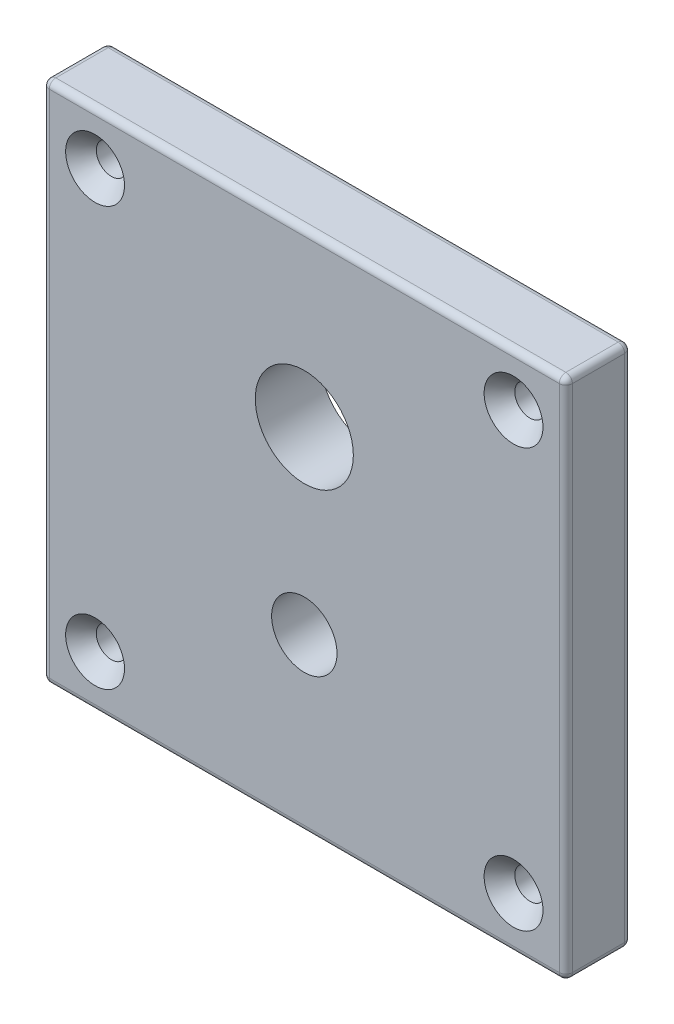
ISO-10303-21;
HEADER;
FILE_DESCRIPTION(('STEP AP214'),'2;1');
FILE_NAME('part.step','',(''),(''),'','','');
FILE_SCHEMA(('AUTOMOTIVE_DESIGN { 1 0 10303 214 1 1 1 1 }'));
ENDSEC;
DATA;
#1=APPLICATION_CONTEXT('core data for automotive mechanical design processes');
#2=APPLICATION_PROTOCOL_DEFINITION('international standard','automotive_design',2000,#1);
#3=PRODUCT_CONTEXT('',#1,'mechanical');
#4=PRODUCT('Part','Part','',(#3));
#5=PRODUCT_RELATED_PRODUCT_CATEGORY('part','',(#4));
#6=PRODUCT_DEFINITION_FORMATION('','',#4);
#7=PRODUCT_DEFINITION_CONTEXT('part definition',#1,'design');
#8=PRODUCT_DEFINITION('design','',#6,#7);
#9=PRODUCT_DEFINITION_SHAPE('','',#8);
#10=(LENGTH_UNIT() NAMED_UNIT(*) SI_UNIT(.MILLI.,.METRE.));
#11=(NAMED_UNIT(*) PLANE_ANGLE_UNIT() SI_UNIT($,.RADIAN.));
#12=(NAMED_UNIT(*) SI_UNIT($,.STERADIAN.) SOLID_ANGLE_UNIT());
#13=UNCERTAINTY_MEASURE_WITH_UNIT(LENGTH_MEASURE(1.E-05),#10,'distance_accuracy_value','');
#14=(GEOMETRIC_REPRESENTATION_CONTEXT(3) GLOBAL_UNCERTAINTY_ASSIGNED_CONTEXT((#13)) GLOBAL_UNIT_ASSIGNED_CONTEXT((#10,
#11,#12)) REPRESENTATION_CONTEXT('',''));
#15=CARTESIAN_POINT('',(0.,0.,0.));
#16=DIRECTION('',(0.,0.,1.));
#17=DIRECTION('',(1.,0.,0.));
#18=AXIS2_PLACEMENT_3D('',#15,#16,#17);
#19=CARTESIAN_POINT('',(25.4,25.4,6.35));
#20=DIRECTION('',(0.,-1.,0.));
#21=DIRECTION('',(0.,0.,-1.));
#22=AXIS2_PLACEMENT_3D('',#19,#20,#21);
#23=PLANE('',#22);
#24=DIRECTION('',(0.,0.,-1.));
#25=VECTOR('',#24,1.);
#26=CARTESIAN_POINT('',(-24.765,25.4,6.35));
#27=LINE('',#26,#25);
#28=CARTESIAN_POINT('',(-24.765,25.4,0.635));
#29=VERTEX_POINT('',#28);
#30=CARTESIAN_POINT('',(-24.765,25.4,5.715));
#31=VERTEX_POINT('',#30);
#32=EDGE_CURVE('E192',#29,#31,#27,.F.);
#33=ORIENTED_EDGE('',*,*,#32,.T.);
#34=DIRECTION('',(-1.,0.,0.));
#35=VECTOR('',#34,1.);
#36=CARTESIAN_POINT('',(25.4,25.4,5.715));
#37=LINE('',#36,#35);
#38=CARTESIAN_POINT('',(24.765,25.4,5.715));
#39=VERTEX_POINT('',#38);
#40=EDGE_CURVE('E194',#31,#39,#37,.F.);
#41=ORIENTED_EDGE('',*,*,#40,.T.);
#42=DIRECTION('',(0.,0.,-1.));
#43=VECTOR('',#42,1.);
#44=CARTESIAN_POINT('',(24.765,25.4,6.35));
#45=LINE('',#44,#43);
#46=CARTESIAN_POINT('',(24.765,25.4,0.635));
#47=VERTEX_POINT('',#46);
#48=EDGE_CURVE('E188',#39,#47,#45,.T.);
#49=ORIENTED_EDGE('',*,*,#48,.T.);
#50=DIRECTION('',(-1.,0.,0.));
#51=VECTOR('',#50,1.);
#52=CARTESIAN_POINT('',(-25.4,25.4,0.635));
#53=LINE('',#52,#51);
#54=EDGE_CURVE('E190',#47,#29,#53,.T.);
#55=ORIENTED_EDGE('',*,*,#54,.T.);
#56=EDGE_LOOP('',(#33,#41,#49,#55));
#57=FACE_BOUND('',#56,.T.);
#58=ADVANCED_FACE('F43',(#57),#23,.F.);
#59=CARTESIAN_POINT('',(-25.4,-25.4,6.35));
#60=DIRECTION('',(1.,0.,0.));
#61=DIRECTION('',(0.,0.,-1.));
#62=AXIS2_PLACEMENT_3D('',#59,#60,#61);
#63=PLANE('',#62);
#64=DIRECTION('',(0.,-1.,0.));
#65=VECTOR('',#64,1.);
#66=CARTESIAN_POINT('',(-25.4,-25.4,5.715));
#67=LINE('',#66,#65);
#68=CARTESIAN_POINT('',(-25.4,-24.765,5.715));
#69=VERTEX_POINT('',#68);
#70=CARTESIAN_POINT('',(-25.4,24.765,5.715));
#71=VERTEX_POINT('',#70);
#72=EDGE_CURVE('E139',#69,#71,#67,.F.);
#73=ORIENTED_EDGE('',*,*,#72,.T.);
#74=DIRECTION('',(0.,0.,-1.));
#75=VECTOR('',#74,1.);
#76=CARTESIAN_POINT('',(-25.4,24.765,6.35));
#77=LINE('',#76,#75);
#78=CARTESIAN_POINT('',(-25.4,24.765,0.635));
#79=VERTEX_POINT('',#78);
#80=EDGE_CURVE('E177',#71,#79,#77,.T.);
#81=ORIENTED_EDGE('',*,*,#80,.T.);
#82=DIRECTION('',(0.,-1.,0.));
#83=VECTOR('',#82,1.);
#84=CARTESIAN_POINT('',(-25.4,-25.4,0.635));
#85=LINE('',#84,#83);
#86=CARTESIAN_POINT('',(-25.4,-24.765,0.635));
#87=VERTEX_POINT('',#86);
#88=EDGE_CURVE('E170',#79,#87,#85,.T.);
#89=ORIENTED_EDGE('',*,*,#88,.T.);
#90=DIRECTION('',(0.,0.,-1.));
#91=VECTOR('',#90,1.);
#92=CARTESIAN_POINT('',(-25.4,-24.765,6.35));
#93=LINE('',#92,#91);
#94=EDGE_CURVE('E168',#87,#69,#93,.F.);
#95=ORIENTED_EDGE('',*,*,#94,.T.);
#96=EDGE_LOOP('',(#73,#81,#89,#95));
#97=FACE_BOUND('',#96,.T.);
#98=ADVANCED_FACE('F342',(#97),#63,.F.);
#99=CARTESIAN_POINT('',(25.4,-25.4,6.35));
#100=DIRECTION('',(0.,1.,0.));
#101=DIRECTION('',(0.,0.,1.));
#102=AXIS2_PLACEMENT_3D('',#99,#100,#101);
#103=PLANE('',#102);
#104=DIRECTION('',(1.,0.,0.));
#105=VECTOR('',#104,1.);
#106=CARTESIAN_POINT('',(25.4,-25.4,5.715));
#107=LINE('',#106,#105);
#108=CARTESIAN_POINT('',(24.765,-25.4,5.715));
#109=VERTEX_POINT('',#108);
#110=CARTESIAN_POINT('',(-24.765,-25.4,5.715));
#111=VERTEX_POINT('',#110);
#112=EDGE_CURVE('E52',#109,#111,#107,.F.);
#113=ORIENTED_EDGE('',*,*,#112,.T.);
#114=DIRECTION('',(0.,0.,-1.));
#115=VECTOR('',#114,1.);
#116=CARTESIAN_POINT('',(-24.765,-25.4,6.35));
#117=LINE('',#116,#115);
#118=CARTESIAN_POINT('',(-24.765,-25.4,0.635));
#119=VERTEX_POINT('',#118);
#120=EDGE_CURVE('E11',#111,#119,#117,.T.);
#121=ORIENTED_EDGE('',*,*,#120,.T.);
#122=DIRECTION('',(1.,0.,0.));
#123=VECTOR('',#122,1.);
#124=CARTESIAN_POINT('',(25.4,-25.4,0.635));
#125=LINE('',#124,#123);
#126=CARTESIAN_POINT('',(24.765,-25.4,0.635));
#127=VERTEX_POINT('',#126);
#128=EDGE_CURVE('E206',#119,#127,#125,.T.);
#129=ORIENTED_EDGE('',*,*,#128,.T.);
#130=DIRECTION('',(0.,0.,-1.));
#131=VECTOR('',#130,1.);
#132=CARTESIAN_POINT('',(24.765,-25.4,6.35));
#133=LINE('',#132,#131);
#134=EDGE_CURVE('E63',#127,#109,#133,.F.);
#135=ORIENTED_EDGE('',*,*,#134,.T.);
#136=EDGE_LOOP('',(#113,#121,#129,#135));
#137=FACE_BOUND('',#136,.T.);
#138=ADVANCED_FACE('F348',(#137),#103,.F.);
#139=CARTESIAN_POINT('',(25.4,-25.4,6.35));
#140=DIRECTION('',(-1.,0.,0.));
#141=DIRECTION('',(0.,0.,1.));
#142=AXIS2_PLACEMENT_3D('',#139,#140,#141);
#143=PLANE('',#142);
#144=DIRECTION('',(0.,0.,-1.));
#145=VECTOR('',#144,1.);
#146=CARTESIAN_POINT('',(25.4,24.765,6.35));
#147=LINE('',#146,#145);
#148=CARTESIAN_POINT('',(25.4,24.765,0.635));
#149=VERTEX_POINT('',#148);
#150=CARTESIAN_POINT('',(25.4,24.765,5.715));
#151=VERTEX_POINT('',#150);
#152=EDGE_CURVE('E201',#149,#151,#147,.F.);
#153=ORIENTED_EDGE('',*,*,#152,.T.);
#154=DIRECTION('',(0.,1.,0.));
#155=VECTOR('',#154,1.);
#156=CARTESIAN_POINT('',(25.4,-25.4,5.715));
#157=LINE('',#156,#155);
#158=CARTESIAN_POINT('',(25.4,-24.765,5.715));
#159=VERTEX_POINT('',#158);
#160=EDGE_CURVE('E203',#151,#159,#157,.F.);
#161=ORIENTED_EDGE('',*,*,#160,.T.);
#162=DIRECTION('',(0.,0.,-1.));
#163=VECTOR('',#162,1.);
#164=CARTESIAN_POINT('',(25.4,-24.765,6.35));
#165=LINE('',#164,#163);
#166=CARTESIAN_POINT('',(25.4,-24.765,0.635));
#167=VERTEX_POINT('',#166);
#168=EDGE_CURVE('E197',#159,#167,#165,.T.);
#169=ORIENTED_EDGE('',*,*,#168,.T.);
#170=DIRECTION('',(0.,1.,0.));
#171=VECTOR('',#170,1.);
#172=CARTESIAN_POINT('',(25.4,25.4,0.635));
#173=LINE('',#172,#171);
#174=EDGE_CURVE('E199',#167,#149,#173,.T.);
#175=ORIENTED_EDGE('',*,*,#174,.T.);
#176=EDGE_LOOP('',(#153,#161,#169,#175));
#177=FACE_BOUND('',#176,.T.);
#178=ADVANCED_FACE('F631',(#177),#143,.F.);
#179=CARTESIAN_POINT('',(0.,0.,6.35));
#180=DIRECTION('',(0.,0.,-1.));
#181=DIRECTION('',(-1.,0.,0.));
#182=AXIS2_PLACEMENT_3D('',#179,#180,#181);
#183=PLANE('',#182);
#184=DIRECTION('',(-1.,0.,0.));
#185=VECTOR('',#184,1.);
#186=CARTESIAN_POINT('',(0.,24.765,6.35));
#187=LINE('',#186,#185);
#188=CARTESIAN_POINT('',(24.765,24.765,6.35));
#189=VERTEX_POINT('',#188);
#190=CARTESIAN_POINT('',(-24.765,24.765,6.35));
#191=VERTEX_POINT('',#190);
#192=EDGE_CURVE('E166',#189,#191,#187,.T.);
#193=ORIENTED_EDGE('',*,*,#192,.T.);
#194=DIRECTION('',(0.,-1.,0.));
#195=VECTOR('',#194,1.);
#196=CARTESIAN_POINT('',(-24.765,0.,6.35));
#197=LINE('',#196,#195);
#198=CARTESIAN_POINT('',(-24.765,-24.765,6.35));
#199=VERTEX_POINT('',#198);
#200=EDGE_CURVE('E137',#191,#199,#197,.T.);
#201=ORIENTED_EDGE('',*,*,#200,.T.);
#202=DIRECTION('',(1.,0.,0.));
#203=VECTOR('',#202,1.);
#204=CARTESIAN_POINT('',(0.,-24.765,6.35));
#205=LINE('',#204,#203);
#206=CARTESIAN_POINT('',(24.765,-24.765,6.35));
#207=VERTEX_POINT('',#206);
#208=EDGE_CURVE('E154',#199,#207,#205,.T.);
#209=ORIENTED_EDGE('',*,*,#208,.T.);
#210=DIRECTION('',(0.,1.,0.));
#211=VECTOR('',#210,1.);
#212=CARTESIAN_POINT('',(24.765,0.,6.35));
#213=LINE('',#212,#211);
#214=EDGE_CURVE('E160',#207,#189,#213,.T.);
#215=ORIENTED_EDGE('',*,*,#214,.T.);
#216=EDGE_LOOP('',(#193,#201,#209,#215));
#217=FACE_BOUND('',#216,.T.);
#218=CARTESIAN_POINT('',(-20.32,20.32,6.35));
#219=DIRECTION('',(0.,0.,1.));
#220=DIRECTION('',(1.,0.,0.));
#221=AXIS2_PLACEMENT_3D('',#218,#219,#220);
#222=CIRCLE('',#221,2.8575);
#223=CARTESIAN_POINT('',(-17.4625,20.32,6.35));
#224=VERTEX_POINT('',#223);
#225=EDGE_CURVE('E265',#224,#224,#222,.T.);
#226=ORIENTED_EDGE('',*,*,#225,.F.);
#227=EDGE_LOOP('',(#226));
#228=FACE_BOUND('',#227,.T.);
#229=CARTESIAN_POINT('',(20.32,20.32,6.35));
#230=DIRECTION('',(0.,0.,1.));
#231=DIRECTION('',(1.,0.,0.));
#232=AXIS2_PLACEMENT_3D('',#229,#230,#231);
#233=CIRCLE('',#232,2.8575);
#234=CARTESIAN_POINT('',(23.1775,20.32,6.35));
#235=VERTEX_POINT('',#234);
#236=EDGE_CURVE('E276',#235,#235,#233,.T.);
#237=ORIENTED_EDGE('',*,*,#236,.F.);
#238=EDGE_LOOP('',(#237));
#239=FACE_BOUND('',#238,.T.);
#240=CARTESIAN_POINT('',(20.32,-20.32,6.35));
#241=DIRECTION('',(0.,0.,1.));
#242=DIRECTION('',(1.,0.,0.));
#243=AXIS2_PLACEMENT_3D('',#240,#241,#242);
#244=CIRCLE('',#243,2.8575);
#245=CARTESIAN_POINT('',(23.1775,-20.32,6.35));
#246=VERTEX_POINT('',#245);
#247=EDGE_CURVE('E284',#246,#246,#244,.T.);
#248=ORIENTED_EDGE('',*,*,#247,.F.);
#249=EDGE_LOOP('',(#248));
#250=FACE_BOUND('',#249,.T.);
#251=CARTESIAN_POINT('',(-20.32,-20.32,6.35));
#252=DIRECTION('',(0.,0.,1.));
#253=DIRECTION('',(1.,0.,0.));
#254=AXIS2_PLACEMENT_3D('',#251,#252,#253);
#255=CIRCLE('',#254,2.8575);
#256=CARTESIAN_POINT('',(-17.4625,-20.32,6.35));
#257=VERTEX_POINT('',#256);
#258=EDGE_CURVE('E290',#257,#257,#255,.T.);
#259=ORIENTED_EDGE('',*,*,#258,.F.);
#260=EDGE_LOOP('',(#259));
#261=FACE_BOUND('',#260,.T.);
#262=CARTESIAN_POINT('',(0.,8.73125,6.35));
#263=DIRECTION('',(0.,0.,1.));
#264=DIRECTION('',(1.,0.,0.));
#265=AXIS2_PLACEMENT_3D('',#262,#263,#264);
#266=CIRCLE('',#265,4.7625);
#267=CARTESIAN_POINT('',(4.7625,8.73125,6.35));
#268=VERTEX_POINT('',#267);
#269=EDGE_CURVE('E161',#268,#268,#266,.T.);
#270=ORIENTED_EDGE('',*,*,#269,.F.);
#271=EDGE_LOOP('',(#270));
#272=FACE_BOUND('',#271,.T.);
#273=CARTESIAN_POINT('',(0.,-8.73125,6.35));
#274=DIRECTION('',(0.,0.,1.));
#275=DIRECTION('',(1.,0.,0.));
#276=AXIS2_PLACEMENT_3D('',#273,#274,#275);
#277=CIRCLE('',#276,3.175);
#278=CARTESIAN_POINT('',(3.175,-8.73125,6.35));
#279=VERTEX_POINT('',#278);
#280=EDGE_CURVE('E308',#279,#279,#277,.T.);
#281=ORIENTED_EDGE('',*,*,#280,.F.);
#282=EDGE_LOOP('',(#281));
#283=FACE_BOUND('',#282,.T.);
#284=ADVANCED_FACE('F163',(#217,#228,#239,#250,#261,#272,#283),#183,.F.);
#285=CARTESIAN_POINT('',(0.,0.,0.));
#286=DIRECTION('',(0.,0.,-1.));
#287=DIRECTION('',(-1.,0.,0.));
#288=AXIS2_PLACEMENT_3D('',#285,#286,#287);
#289=PLANE('',#288);
#290=DIRECTION('',(1.,0.,0.));
#291=VECTOR('',#290,1.);
#292=CARTESIAN_POINT('',(-25.4,-24.765,0.));
#293=LINE('',#292,#291);
#294=CARTESIAN_POINT('',(24.765,-24.765,0.));
#295=VERTEX_POINT('',#294);
#296=CARTESIAN_POINT('',(-24.765,-24.765,0.));
#297=VERTEX_POINT('',#296);
#298=EDGE_CURVE('E179',#295,#297,#293,.F.);
#299=ORIENTED_EDGE('',*,*,#298,.T.);
#300=DIRECTION('',(0.,-1.,0.));
#301=VECTOR('',#300,1.);
#302=CARTESIAN_POINT('',(-24.765,25.4,0.));
#303=LINE('',#302,#301);
#304=CARTESIAN_POINT('',(-24.765,24.765,0.));
#305=VERTEX_POINT('',#304);
#306=EDGE_CURVE('E185',#297,#305,#303,.F.);
#307=ORIENTED_EDGE('',*,*,#306,.T.);
#308=DIRECTION('',(-1.,0.,0.));
#309=VECTOR('',#308,1.);
#310=CARTESIAN_POINT('',(25.4,24.765,0.));
#311=LINE('',#310,#309);
#312=CARTESIAN_POINT('',(24.765,24.765,0.));
#313=VERTEX_POINT('',#312);
#314=EDGE_CURVE('E183',#305,#313,#311,.F.);
#315=ORIENTED_EDGE('',*,*,#314,.T.);
#316=DIRECTION('',(0.,1.,0.));
#317=VECTOR('',#316,1.);
#318=CARTESIAN_POINT('',(24.765,-25.4,0.));
#319=LINE('',#318,#317);
#320=EDGE_CURVE('E181',#313,#295,#319,.F.);
#321=ORIENTED_EDGE('',*,*,#320,.T.);
#322=EDGE_LOOP('',(#299,#307,#315,#321));
#323=FACE_BOUND('',#322,.T.);
#324=CARTESIAN_POINT('',(20.32,20.32,0.));
#325=DIRECTION('',(0.,0.,-1.));
#326=DIRECTION('',(-1.,0.,0.));
#327=AXIS2_PLACEMENT_3D('',#324,#325,#326);
#328=CIRCLE('',#327,1.4732);
#329=CARTESIAN_POINT('',(18.8468,20.32,0.));
#330=VERTEX_POINT('',#329);
#331=EDGE_CURVE('E300',#330,#330,#328,.F.);
#332=ORIENTED_EDGE('',*,*,#331,.T.);
#333=EDGE_LOOP('',(#332));
#334=FACE_BOUND('',#333,.T.);
#335=CARTESIAN_POINT('',(-20.32,-20.32,0.));
#336=DIRECTION('',(0.,0.,-1.));
#337=DIRECTION('',(-1.,0.,0.));
#338=AXIS2_PLACEMENT_3D('',#335,#336,#337);
#339=CIRCLE('',#338,1.4732);
#340=CARTESIAN_POINT('',(-21.7932,-20.32,0.));
#341=VERTEX_POINT('',#340);
#342=EDGE_CURVE('E299',#341,#341,#339,.F.);
#343=ORIENTED_EDGE('',*,*,#342,.T.);
#344=EDGE_LOOP('',(#343));
#345=FACE_BOUND('',#344,.T.);
#346=CARTESIAN_POINT('',(20.32,-20.32,0.));
#347=DIRECTION('',(0.,0.,-1.));
#348=DIRECTION('',(-1.,0.,0.));
#349=AXIS2_PLACEMENT_3D('',#346,#347,#348);
#350=CIRCLE('',#349,1.4732);
#351=CARTESIAN_POINT('',(18.8468,-20.32,0.));
#352=VERTEX_POINT('',#351);
#353=EDGE_CURVE('E296',#352,#352,#350,.F.);
#354=ORIENTED_EDGE('',*,*,#353,.T.);
#355=EDGE_LOOP('',(#354));
#356=FACE_BOUND('',#355,.T.);
#357=CARTESIAN_POINT('',(-20.32,20.32,0.));
#358=DIRECTION('',(0.,0.,-1.));
#359=DIRECTION('',(-1.,0.,0.));
#360=AXIS2_PLACEMENT_3D('',#357,#358,#359);
#361=CIRCLE('',#360,1.4732);
#362=CARTESIAN_POINT('',(-21.7932,20.32,0.));
#363=VERTEX_POINT('',#362);
#364=EDGE_CURVE('E303',#363,#363,#361,.F.);
#365=ORIENTED_EDGE('',*,*,#364,.T.);
#366=EDGE_LOOP('',(#365));
#367=FACE_BOUND('',#366,.T.);
#368=CARTESIAN_POINT('',(0.,8.73125,0.));
#369=DIRECTION('',(0.,0.,-1.));
#370=DIRECTION('',(-1.,0.,0.));
#371=AXIS2_PLACEMENT_3D('',#368,#369,#370);
#372=CIRCLE('',#371,4.7625);
#373=CARTESIAN_POINT('',(-4.7625,8.73125,0.));
#374=VERTEX_POINT('',#373);
#375=EDGE_CURVE('E311',#374,#374,#372,.F.);
#376=ORIENTED_EDGE('',*,*,#375,.T.);
#377=EDGE_LOOP('',(#376));
#378=FACE_BOUND('',#377,.T.);
#379=CARTESIAN_POINT('',(0.,-8.73125,0.));
#380=DIRECTION('',(0.,0.,-1.));
#381=DIRECTION('',(-1.,0.,0.));
#382=AXIS2_PLACEMENT_3D('',#379,#380,#381);
#383=CIRCLE('',#382,3.175);
#384=CARTESIAN_POINT('',(-3.175,-8.73125,0.));
#385=VERTEX_POINT('',#384);
#386=EDGE_CURVE('E314',#385,#385,#383,.F.);
#387=ORIENTED_EDGE('',*,*,#386,.T.);
#388=EDGE_LOOP('',(#387));
#389=FACE_BOUND('',#388,.T.);
#390=ADVANCED_FACE('F614',(#323,#334,#345,#356,#367,#378,#389),#289,.T.);
#391=CARTESIAN_POINT('',(0.,-8.73125,-0.00100000000000013));
#392=DIRECTION('',(0.,0.,1.));
#393=DIRECTION('',(1.,0.,0.));
#394=AXIS2_PLACEMENT_3D('',#391,#392,#393);
#395=CYLINDRICAL_SURFACE('',#394,3.175);
#396=ORIENTED_EDGE('',*,*,#386,.F.);
#397=EDGE_LOOP('',(#396));
#398=FACE_BOUND('',#397,.T.);
#399=ORIENTED_EDGE('',*,*,#280,.T.);
#400=EDGE_LOOP('',(#399));
#401=FACE_BOUND('',#400,.T.);
#402=ADVANCED_FACE('F605',(#398,#401),#395,.F.);
#403=CARTESIAN_POINT('',(0.,8.73125,-0.00100000000000013));
#404=DIRECTION('',(0.,0.,1.));
#405=DIRECTION('',(1.,0.,0.));
#406=AXIS2_PLACEMENT_3D('',#403,#404,#405);
#407=CYLINDRICAL_SURFACE('',#406,4.7625);
#408=ORIENTED_EDGE('',*,*,#375,.F.);
#409=EDGE_LOOP('',(#408));
#410=FACE_BOUND('',#409,.T.);
#411=ORIENTED_EDGE('',*,*,#269,.T.);
#412=EDGE_LOOP('',(#411));
#413=FACE_BOUND('',#412,.T.);
#414=ADVANCED_FACE('F596',(#410,#413),#407,.F.);
#415=CARTESIAN_POINT('',(-20.32,20.32,-0.00100000000000013));
#416=DIRECTION('',(0.,0.,1.));
#417=DIRECTION('',(1.,0.,0.));
#418=AXIS2_PLACEMENT_3D('',#415,#416,#417);
#419=CYLINDRICAL_SURFACE('',#418,1.4732);
#420=CARTESIAN_POINT('',(-20.32,20.32,4.75754501388395));
#421=DIRECTION('',(0.,0.,1.));
#422=DIRECTION('',(1.,0.,0.));
#423=AXIS2_PLACEMENT_3D('',#420,#421,#422);
#424=CIRCLE('',#423,1.4732);
#425=CARTESIAN_POINT('',(-18.8468,20.32,4.75754501388395));
#426=VERTEX_POINT('',#425);
#427=EDGE_CURVE('E271',#426,#426,#424,.T.);
#428=ORIENTED_EDGE('',*,*,#427,.T.);
#429=EDGE_LOOP('',(#428));
#430=FACE_BOUND('',#429,.T.);
#431=ORIENTED_EDGE('',*,*,#364,.F.);
#432=EDGE_LOOP('',(#431));
#433=FACE_BOUND('',#432,.T.);
#434=ADVANCED_FACE('F587',(#430,#433),#419,.F.);
#435=CARTESIAN_POINT('',(20.32,-20.32,-0.00100000000000013));
#436=DIRECTION('',(0.,0.,1.));
#437=DIRECTION('',(1.,0.,0.));
#438=AXIS2_PLACEMENT_3D('',#435,#436,#437);
#439=CYLINDRICAL_SURFACE('',#438,1.4732);
#440=CARTESIAN_POINT('',(20.32,-20.32,4.75754501388395));
#441=DIRECTION('',(0.,0.,1.));
#442=DIRECTION('',(1.,0.,0.));
#443=AXIS2_PLACEMENT_3D('',#440,#441,#442);
#444=CIRCLE('',#443,1.4732);
#445=CARTESIAN_POINT('',(21.7932,-20.32,4.75754501388395));
#446=VERTEX_POINT('',#445);
#447=EDGE_CURVE('E287',#446,#446,#444,.T.);
#448=ORIENTED_EDGE('',*,*,#447,.T.);
#449=EDGE_LOOP('',(#448));
#450=FACE_BOUND('',#449,.T.);
#451=ORIENTED_EDGE('',*,*,#353,.F.);
#452=EDGE_LOOP('',(#451));
#453=FACE_BOUND('',#452,.T.);
#454=ADVANCED_FACE('F578',(#450,#453),#439,.F.);
#455=CARTESIAN_POINT('',(-20.32,-20.32,-0.00100000000000013));
#456=DIRECTION('',(0.,0.,1.));
#457=DIRECTION('',(1.,0.,0.));
#458=AXIS2_PLACEMENT_3D('',#455,#456,#457);
#459=CYLINDRICAL_SURFACE('',#458,1.4732);
#460=CARTESIAN_POINT('',(-20.32,-20.32,4.75754501388395));
#461=DIRECTION('',(0.,0.,1.));
#462=DIRECTION('',(1.,0.,0.));
#463=AXIS2_PLACEMENT_3D('',#460,#461,#462);
#464=CIRCLE('',#463,1.4732);
#465=CARTESIAN_POINT('',(-18.8468,-20.32,4.75754501388395));
#466=VERTEX_POINT('',#465);
#467=EDGE_CURVE('E293',#466,#466,#464,.T.);
#468=ORIENTED_EDGE('',*,*,#467,.T.);
#469=EDGE_LOOP('',(#468));
#470=FACE_BOUND('',#469,.T.);
#471=ORIENTED_EDGE('',*,*,#342,.F.);
#472=EDGE_LOOP('',(#471));
#473=FACE_BOUND('',#472,.T.);
#474=ADVANCED_FACE('F569',(#470,#473),#459,.F.);
#475=CARTESIAN_POINT('',(20.32,20.32,-0.00100000000000013));
#476=DIRECTION('',(0.,0.,1.));
#477=DIRECTION('',(1.,0.,0.));
#478=AXIS2_PLACEMENT_3D('',#475,#476,#477);
#479=CYLINDRICAL_SURFACE('',#478,1.4732);
#480=CARTESIAN_POINT('',(20.32,20.32,4.75754501388395));
#481=DIRECTION('',(0.,0.,1.));
#482=DIRECTION('',(1.,0.,0.));
#483=AXIS2_PLACEMENT_3D('',#480,#481,#482);
#484=CIRCLE('',#483,1.4732);
#485=CARTESIAN_POINT('',(21.7932,20.32,4.75754501388395));
#486=VERTEX_POINT('',#485);
#487=EDGE_CURVE('E281',#486,#486,#484,.T.);
#488=ORIENTED_EDGE('',*,*,#487,.T.);
#489=EDGE_LOOP('',(#488));
#490=FACE_BOUND('',#489,.T.);
#491=ORIENTED_EDGE('',*,*,#331,.F.);
#492=EDGE_LOOP('',(#491));
#493=FACE_BOUND('',#492,.T.);
#494=ADVANCED_FACE('F560',(#490,#493),#479,.F.);
#495=CARTESIAN_POINT('',(-20.32,-20.32,6.35));
#496=DIRECTION('',(0.,0.,1.));
#497=DIRECTION('',(1.,0.,0.));
#498=AXIS2_PLACEMENT_3D('',#495,#496,#497);
#499=CONICAL_SURFACE('',#498,2.8575,0.715584993317675);
#500=ORIENTED_EDGE('',*,*,#467,.F.);
#501=EDGE_LOOP('',(#500));
#502=FACE_BOUND('',#501,.T.);
#503=ORIENTED_EDGE('',*,*,#258,.T.);
#504=EDGE_LOOP('',(#503));
#505=FACE_BOUND('',#504,.T.);
#506=ADVANCED_FACE('F551',(#502,#505),#499,.F.);
#507=CARTESIAN_POINT('',(20.32,-20.32,6.35));
#508=DIRECTION('',(0.,0.,1.));
#509=DIRECTION('',(1.,0.,0.));
#510=AXIS2_PLACEMENT_3D('',#507,#508,#509);
#511=CONICAL_SURFACE('',#510,2.8575,0.715584993317675);
#512=ORIENTED_EDGE('',*,*,#447,.F.);
#513=EDGE_LOOP('',(#512));
#514=FACE_BOUND('',#513,.T.);
#515=ORIENTED_EDGE('',*,*,#247,.T.);
#516=EDGE_LOOP('',(#515));
#517=FACE_BOUND('',#516,.T.);
#518=ADVANCED_FACE('F542',(#514,#517),#511,.F.);
#519=CARTESIAN_POINT('',(20.32,20.32,6.35));
#520=DIRECTION('',(0.,0.,1.));
#521=DIRECTION('',(1.,0.,0.));
#522=AXIS2_PLACEMENT_3D('',#519,#520,#521);
#523=CONICAL_SURFACE('',#522,2.8575,0.715584993317675);
#524=ORIENTED_EDGE('',*,*,#487,.F.);
#525=EDGE_LOOP('',(#524));
#526=FACE_BOUND('',#525,.T.);
#527=ORIENTED_EDGE('',*,*,#236,.T.);
#528=EDGE_LOOP('',(#527));
#529=FACE_BOUND('',#528,.T.);
#530=ADVANCED_FACE('F533',(#526,#529),#523,.F.);
#531=CARTESIAN_POINT('',(-20.32,20.32,6.35));
#532=DIRECTION('',(0.,0.,1.));
#533=DIRECTION('',(1.,0.,0.));
#534=AXIS2_PLACEMENT_3D('',#531,#532,#533);
#535=CONICAL_SURFACE('',#534,2.8575,0.715584993317675);
#536=ORIENTED_EDGE('',*,*,#427,.F.);
#537=EDGE_LOOP('',(#536));
#538=FACE_BOUND('',#537,.T.);
#539=ORIENTED_EDGE('',*,*,#225,.T.);
#540=EDGE_LOOP('',(#539));
#541=FACE_BOUND('',#540,.T.);
#542=ADVANCED_FACE('F526',(#538,#541),#535,.F.);
#543=CARTESIAN_POINT('',(24.765,-25.4,0.635));
#544=DIRECTION('',(0.,-1.,0.));
#545=DIRECTION('',(0.,0.,-1.));
#546=AXIS2_PLACEMENT_3D('',#543,#544,#545);
#547=CYLINDRICAL_SURFACE('',#546,0.635);
#548=CARTESIAN_POINT('',(24.765,24.765,0.635));
#549=DIRECTION('',(0.,1.,0.));
#550=DIRECTION('',(0.,0.,1.));
#551=AXIS2_PLACEMENT_3D('',#548,#549,#550);
#552=CIRCLE('',#551,0.635);
#553=EDGE_CURVE('E47',#149,#313,#552,.T.);
#554=ORIENTED_EDGE('',*,*,#553,.F.);
#555=ORIENTED_EDGE('',*,*,#174,.F.);
#556=CARTESIAN_POINT('',(24.765,-24.765,0.635));
#557=DIRECTION('',(0.,-1.,0.));
#558=DIRECTION('',(0.,0.,-1.));
#559=AXIS2_PLACEMENT_3D('',#556,#557,#558);
#560=CIRCLE('',#559,0.635);
#561=EDGE_CURVE('E258',#295,#167,#560,.T.);
#562=ORIENTED_EDGE('',*,*,#561,.F.);
#563=ORIENTED_EDGE('',*,*,#320,.F.);
#564=EDGE_LOOP('',(#554,#555,#562,#563));
#565=FACE_BOUND('',#564,.T.);
#566=ADVANCED_FACE('F45',(#565),#547,.T.);
#567=CARTESIAN_POINT('',(24.765,24.765,0.635));
#568=DIRECTION('',(0.,0.,-1.));
#569=DIRECTION('',(-1.,0.,0.));
#570=AXIS2_PLACEMENT_3D('',#567,#568,#569);
#571=SPHERICAL_SURFACE('',#570,0.635);
#572=CARTESIAN_POINT('',(24.765,24.765,0.635));
#573=DIRECTION('',(0.,0.,-1.));
#574=DIRECTION('',(-1.,0.,0.));
#575=AXIS2_PLACEMENT_3D('',#572,#573,#574);
#576=CIRCLE('',#575,0.635);
#577=EDGE_CURVE('E253',#149,#47,#576,.F.);
#578=ORIENTED_EDGE('',*,*,#577,.F.);
#579=ORIENTED_EDGE('',*,*,#553,.T.);
#580=CARTESIAN_POINT('',(24.765,24.765,0.635));
#581=DIRECTION('',(1.,0.,0.));
#582=DIRECTION('',(0.,0.,-1.));
#583=AXIS2_PLACEMENT_3D('',#580,#581,#582);
#584=CIRCLE('',#583,0.635);
#585=EDGE_CURVE('E256',#47,#313,#584,.F.);
#586=ORIENTED_EDGE('',*,*,#585,.F.);
#587=EDGE_LOOP('',(#578,#579,#586));
#588=FACE_BOUND('',#587,.T.);
#589=ADVANCED_FACE('F512',(#588),#571,.T.);
#590=CARTESIAN_POINT('',(24.765,-24.765,0.635));
#591=DIRECTION('',(1.,0.,0.));
#592=DIRECTION('',(0.,0.,-1.));
#593=AXIS2_PLACEMENT_3D('',#590,#591,#592);
#594=SPHERICAL_SURFACE('',#593,0.635);
#595=CARTESIAN_POINT('',(24.765,-24.765,0.635));
#596=DIRECTION('',(1.,0.,0.));
#597=DIRECTION('',(0.,0.,-1.));
#598=AXIS2_PLACEMENT_3D('',#595,#596,#597);
#599=CIRCLE('',#598,0.635);
#600=EDGE_CURVE('E247',#295,#127,#599,.F.);
#601=ORIENTED_EDGE('',*,*,#600,.F.);
#602=ORIENTED_EDGE('',*,*,#561,.T.);
#603=CARTESIAN_POINT('',(24.765,-24.765,0.635));
#604=DIRECTION('',(0.,0.,-1.));
#605=DIRECTION('',(-1.,0.,0.));
#606=AXIS2_PLACEMENT_3D('',#603,#604,#605);
#607=CIRCLE('',#606,0.635);
#608=EDGE_CURVE('E250',#127,#167,#607,.F.);
#609=ORIENTED_EDGE('',*,*,#608,.F.);
#610=EDGE_LOOP('',(#601,#602,#609));
#611=FACE_BOUND('',#610,.T.);
#612=ADVANCED_FACE('F354',(#611),#594,.T.);
#613=CARTESIAN_POINT('',(25.4,24.765,0.635));
#614=DIRECTION('',(1.,0.,0.));
#615=DIRECTION('',(0.,0.,-1.));
#616=AXIS2_PLACEMENT_3D('',#613,#614,#615);
#617=CYLINDRICAL_SURFACE('',#616,0.635);
#618=ORIENTED_EDGE('',*,*,#585,.T.);
#619=ORIENTED_EDGE('',*,*,#314,.F.);
#620=CARTESIAN_POINT('',(-24.765,24.765,0.635));
#621=DIRECTION('',(-1.,0.,0.));
#622=DIRECTION('',(0.,0.,1.));
#623=AXIS2_PLACEMENT_3D('',#620,#621,#622);
#624=CIRCLE('',#623,0.635);
#625=EDGE_CURVE('E242',#29,#305,#624,.T.);
#626=ORIENTED_EDGE('',*,*,#625,.F.);
#627=ORIENTED_EDGE('',*,*,#54,.F.);
#628=EDGE_LOOP('',(#618,#619,#626,#627));
#629=FACE_BOUND('',#628,.T.);
#630=ADVANCED_FACE('F495',(#629),#617,.T.);
#631=CARTESIAN_POINT('',(24.765,24.765,6.35));
#632=DIRECTION('',(0.,0.,-1.));
#633=DIRECTION('',(-1.,0.,0.));
#634=AXIS2_PLACEMENT_3D('',#631,#632,#633);
#635=CYLINDRICAL_SURFACE('',#634,0.635);
#636=ORIENTED_EDGE('',*,*,#577,.T.);
#637=ORIENTED_EDGE('',*,*,#48,.F.);
#638=CARTESIAN_POINT('',(24.765,24.765,5.715));
#639=DIRECTION('',(0.,0.,1.));
#640=DIRECTION('',(1.,0.,0.));
#641=AXIS2_PLACEMENT_3D('',#638,#639,#640);
#642=CIRCLE('',#641,0.635);
#643=EDGE_CURVE('E239',#151,#39,#642,.T.);
#644=ORIENTED_EDGE('',*,*,#643,.F.);
#645=ORIENTED_EDGE('',*,*,#152,.F.);
#646=EDGE_LOOP('',(#636,#637,#644,#645));
#647=FACE_BOUND('',#646,.T.);
#648=ADVANCED_FACE('F487',(#647),#635,.T.);
#649=CARTESIAN_POINT('',(24.765,0.,5.715));
#650=DIRECTION('',(0.,1.,0.));
#651=DIRECTION('',(0.,0.,1.));
#652=AXIS2_PLACEMENT_3D('',#649,#650,#651);
#653=CYLINDRICAL_SURFACE('',#652,0.635);
#654=CARTESIAN_POINT('',(24.765,-24.765,5.715));
#655=DIRECTION('',(0.,-1.,0.));
#656=DIRECTION('',(0.,0.,-1.));
#657=AXIS2_PLACEMENT_3D('',#654,#655,#656);
#658=CIRCLE('',#657,0.635);
#659=EDGE_CURVE('E233',#159,#207,#658,.T.);
#660=ORIENTED_EDGE('',*,*,#659,.F.);
#661=ORIENTED_EDGE('',*,*,#160,.F.);
#662=CARTESIAN_POINT('',(24.765,24.765,5.715));
#663=DIRECTION('',(0.,1.,0.));
#664=DIRECTION('',(0.,0.,1.));
#665=AXIS2_PLACEMENT_3D('',#662,#663,#664);
#666=CIRCLE('',#665,0.635);
#667=EDGE_CURVE('E236',#189,#151,#666,.T.);
#668=ORIENTED_EDGE('',*,*,#667,.F.);
#669=ORIENTED_EDGE('',*,*,#214,.F.);
#670=EDGE_LOOP('',(#660,#661,#668,#669));
#671=FACE_BOUND('',#670,.T.);
#672=ADVANCED_FACE('F323',(#671),#653,.T.);
#673=CARTESIAN_POINT('',(24.765,-24.765,6.35));
#674=DIRECTION('',(0.,0.,-1.));
#675=DIRECTION('',(-1.,0.,0.));
#676=AXIS2_PLACEMENT_3D('',#673,#674,#675);
#677=CYLINDRICAL_SURFACE('',#676,0.635);
#678=ORIENTED_EDGE('',*,*,#608,.T.);
#679=ORIENTED_EDGE('',*,*,#168,.F.);
#680=CARTESIAN_POINT('',(24.765,-24.765,5.715));
#681=DIRECTION('',(0.,0.,1.));
#682=DIRECTION('',(1.,0.,0.));
#683=AXIS2_PLACEMENT_3D('',#680,#681,#682);
#684=CIRCLE('',#683,0.635);
#685=EDGE_CURVE('E231',#109,#159,#684,.T.);
#686=ORIENTED_EDGE('',*,*,#685,.F.);
#687=ORIENTED_EDGE('',*,*,#134,.F.);
#688=EDGE_LOOP('',(#678,#679,#686,#687));
#689=FACE_BOUND('',#688,.T.);
#690=ADVANCED_FACE('F357',(#689),#677,.T.);
#691=CARTESIAN_POINT('',(25.4,-24.765,0.635));
#692=DIRECTION('',(-1.,0.,0.));
#693=DIRECTION('',(0.,0.,1.));
#694=AXIS2_PLACEMENT_3D('',#691,#692,#693);
#695=CYLINDRICAL_SURFACE('',#694,0.635);
#696=ORIENTED_EDGE('',*,*,#600,.T.);
#697=ORIENTED_EDGE('',*,*,#128,.F.);
#698=CARTESIAN_POINT('',(-24.765,-24.765,0.635));
#699=DIRECTION('',(-1.,0.,0.));
#700=DIRECTION('',(0.,-1.,0.));
#701=AXIS2_PLACEMENT_3D('',#698,#699,#700);
#702=CIRCLE('',#701,0.635);
#703=EDGE_CURVE('E228',#297,#119,#702,.T.);
#704=ORIENTED_EDGE('',*,*,#703,.F.);
#705=ORIENTED_EDGE('',*,*,#298,.F.);
#706=EDGE_LOOP('',(#696,#697,#704,#705));
#707=FACE_BOUND('',#706,.T.);
#708=ADVANCED_FACE('F353',(#707),#695,.T.);
#709=CARTESIAN_POINT('',(-24.765,-25.4,0.635));
#710=DIRECTION('',(0.,1.,0.));
#711=DIRECTION('',(0.,0.,1.));
#712=AXIS2_PLACEMENT_3D('',#709,#710,#711);
#713=CYLINDRICAL_SURFACE('',#712,0.635);
#714=CARTESIAN_POINT('',(-24.765,24.765,0.635));
#715=DIRECTION('',(0.,1.,0.));
#716=DIRECTION('',(-1.,0.,0.));
#717=AXIS2_PLACEMENT_3D('',#714,#715,#716);
#718=CIRCLE('',#717,0.635);
#719=EDGE_CURVE('E244',#305,#79,#718,.T.);
#720=ORIENTED_EDGE('',*,*,#719,.F.);
#721=ORIENTED_EDGE('',*,*,#306,.F.);
#722=CARTESIAN_POINT('',(-24.765,-24.765,0.635));
#723=DIRECTION('',(0.,-1.,0.));
#724=DIRECTION('',(0.,0.,-1.));
#725=AXIS2_PLACEMENT_3D('',#722,#723,#724);
#726=CIRCLE('',#725,0.635);
#727=EDGE_CURVE('E225',#87,#297,#726,.T.);
#728=ORIENTED_EDGE('',*,*,#727,.F.);
#729=ORIENTED_EDGE('',*,*,#88,.F.);
#730=EDGE_LOOP('',(#720,#721,#728,#729));
#731=FACE_BOUND('',#730,.T.);
#732=ADVANCED_FACE('F456',(#731),#713,.T.);
#733=CARTESIAN_POINT('',(-24.765,24.765,0.635));
#734=DIRECTION('',(0.,0.,-1.));
#735=DIRECTION('',(-1.,0.,0.));
#736=AXIS2_PLACEMENT_3D('',#733,#734,#735);
#737=SPHERICAL_SURFACE('',#736,0.635);
#738=ORIENTED_EDGE('',*,*,#625,.T.);
#739=ORIENTED_EDGE('',*,*,#719,.T.);
#740=CARTESIAN_POINT('',(-24.765,24.765,0.635));
#741=DIRECTION('',(0.,0.,-1.));
#742=DIRECTION('',(-1.,0.,0.));
#743=AXIS2_PLACEMENT_3D('',#740,#741,#742);
#744=CIRCLE('',#743,0.635);
#745=EDGE_CURVE('E222',#29,#79,#744,.F.);
#746=ORIENTED_EDGE('',*,*,#745,.F.);
#747=EDGE_LOOP('',(#738,#739,#746));
#748=FACE_BOUND('',#747,.T.);
#749=ADVANCED_FACE('F369',(#748),#737,.T.);
#750=CARTESIAN_POINT('',(24.765,24.765,5.715));
#751=DIRECTION('',(1.,0.,0.));
#752=DIRECTION('',(0.,0.,-1.));
#753=AXIS2_PLACEMENT_3D('',#750,#751,#752);
#754=SPHERICAL_SURFACE('',#753,0.635);
#755=ORIENTED_EDGE('',*,*,#667,.T.);
#756=ORIENTED_EDGE('',*,*,#643,.T.);
#757=CARTESIAN_POINT('',(24.765,24.765,5.715));
#758=DIRECTION('',(1.,0.,0.));
#759=DIRECTION('',(0.,0.,-1.));
#760=AXIS2_PLACEMENT_3D('',#757,#758,#759);
#761=CIRCLE('',#760,0.635);
#762=EDGE_CURVE('E220',#189,#39,#761,.F.);
#763=ORIENTED_EDGE('',*,*,#762,.F.);
#764=EDGE_LOOP('',(#755,#756,#763));
#765=FACE_BOUND('',#764,.T.);
#766=ADVANCED_FACE('F326',(#765),#754,.T.);
#767=CARTESIAN_POINT('',(24.765,-24.765,5.715));
#768=DIRECTION('',(1.,0.,0.));
#769=DIRECTION('',(0.,0.,-1.));
#770=AXIS2_PLACEMENT_3D('',#767,#768,#769);
#771=SPHERICAL_SURFACE('',#770,0.635);
#772=ORIENTED_EDGE('',*,*,#685,.T.);
#773=ORIENTED_EDGE('',*,*,#659,.T.);
#774=CARTESIAN_POINT('',(24.765,-24.765,5.715));
#775=DIRECTION('',(1.,0.,0.));
#776=DIRECTION('',(0.,0.,-1.));
#777=AXIS2_PLACEMENT_3D('',#774,#775,#776);
#778=CIRCLE('',#777,0.635);
#779=EDGE_CURVE('E157',#109,#207,#778,.F.);
#780=ORIENTED_EDGE('',*,*,#779,.F.);
#781=EDGE_LOOP('',(#772,#773,#780));
#782=FACE_BOUND('',#781,.T.);
#783=ADVANCED_FACE('F359',(#782),#771,.T.);
#784=CARTESIAN_POINT('',(-24.765,-24.765,0.635));
#785=DIRECTION('',(0.,0.,-1.));
#786=DIRECTION('',(-1.,0.,0.));
#787=AXIS2_PLACEMENT_3D('',#784,#785,#786);
#788=SPHERICAL_SURFACE('',#787,0.635);
#789=ORIENTED_EDGE('',*,*,#727,.T.);
#790=ORIENTED_EDGE('',*,*,#703,.T.);
#791=CARTESIAN_POINT('',(-24.765,-24.765,0.635));
#792=DIRECTION('',(0.,0.,-1.));
#793=DIRECTION('',(-1.,0.,0.));
#794=AXIS2_PLACEMENT_3D('',#791,#792,#793);
#795=CIRCLE('',#794,0.635);
#796=EDGE_CURVE('E217',#87,#119,#795,.F.);
#797=ORIENTED_EDGE('',*,*,#796,.F.);
#798=EDGE_LOOP('',(#789,#790,#797));
#799=FACE_BOUND('',#798,.T.);
#800=ADVANCED_FACE('F361',(#799),#788,.T.);
#801=CARTESIAN_POINT('',(-24.765,24.765,6.35));
#802=DIRECTION('',(0.,0.,-1.));
#803=DIRECTION('',(-1.,0.,0.));
#804=AXIS2_PLACEMENT_3D('',#801,#802,#803);
#805=CYLINDRICAL_SURFACE('',#804,0.635);
#806=ORIENTED_EDGE('',*,*,#745,.T.);
#807=ORIENTED_EDGE('',*,*,#80,.F.);
#808=CARTESIAN_POINT('',(-24.765,24.765,5.715));
#809=DIRECTION('',(0.,0.,1.));
#810=DIRECTION('',(1.,0.,0.));
#811=AXIS2_PLACEMENT_3D('',#808,#809,#810);
#812=CIRCLE('',#811,0.635);
#813=EDGE_CURVE('E214',#31,#71,#812,.T.);
#814=ORIENTED_EDGE('',*,*,#813,.F.);
#815=ORIENTED_EDGE('',*,*,#32,.F.);
#816=EDGE_LOOP('',(#806,#807,#814,#815));
#817=FACE_BOUND('',#816,.T.);
#818=ADVANCED_FACE('F338',(#817),#805,.T.);
#819=CARTESIAN_POINT('',(0.,24.765,5.715));
#820=DIRECTION('',(-1.,0.,0.));
#821=DIRECTION('',(0.,0.,1.));
#822=AXIS2_PLACEMENT_3D('',#819,#820,#821);
#823=CYLINDRICAL_SURFACE('',#822,0.635);
#824=ORIENTED_EDGE('',*,*,#762,.T.);
#825=ORIENTED_EDGE('',*,*,#40,.F.);
#826=CARTESIAN_POINT('',(-24.765,24.765,5.715));
#827=DIRECTION('',(-1.,0.,0.));
#828=DIRECTION('',(0.,0.,1.));
#829=AXIS2_PLACEMENT_3D('',#826,#827,#828);
#830=CIRCLE('',#829,0.635);
#831=EDGE_CURVE('E151',#191,#31,#830,.T.);
#832=ORIENTED_EDGE('',*,*,#831,.F.);
#833=ORIENTED_EDGE('',*,*,#192,.F.);
#834=EDGE_LOOP('',(#824,#825,#832,#833));
#835=FACE_BOUND('',#834,.T.);
#836=ADVANCED_FACE('F330',(#835),#823,.T.);
#837=CARTESIAN_POINT('',(0.,-24.765,5.715));
#838=DIRECTION('',(1.,0.,0.));
#839=DIRECTION('',(0.,0.,-1.));
#840=AXIS2_PLACEMENT_3D('',#837,#838,#839);
#841=CYLINDRICAL_SURFACE('',#840,0.635);
#842=ORIENTED_EDGE('',*,*,#779,.T.);
#843=ORIENTED_EDGE('',*,*,#208,.F.);
#844=CARTESIAN_POINT('',(-24.765,-24.765,5.715));
#845=DIRECTION('',(-1.,0.,0.));
#846=DIRECTION('',(0.,0.,1.));
#847=AXIS2_PLACEMENT_3D('',#844,#845,#846);
#848=CIRCLE('',#847,0.635);
#849=EDGE_CURVE('E145',#111,#199,#848,.T.);
#850=ORIENTED_EDGE('',*,*,#849,.F.);
#851=ORIENTED_EDGE('',*,*,#112,.F.);
#852=EDGE_LOOP('',(#842,#843,#850,#851));
#853=FACE_BOUND('',#852,.T.);
#854=ADVANCED_FACE('F155',(#853),#841,.T.);
#855=CARTESIAN_POINT('',(-24.765,-24.765,6.35));
#856=DIRECTION('',(0.,0.,-1.));
#857=DIRECTION('',(-1.,0.,0.));
#858=AXIS2_PLACEMENT_3D('',#855,#856,#857);
#859=CYLINDRICAL_SURFACE('',#858,0.635);
#860=ORIENTED_EDGE('',*,*,#796,.T.);
#861=ORIENTED_EDGE('',*,*,#120,.F.);
#862=CARTESIAN_POINT('',(-24.765,-24.765,5.715));
#863=DIRECTION('',(0.,0.,1.));
#864=DIRECTION('',(1.,0.,0.));
#865=AXIS2_PLACEMENT_3D('',#862,#863,#864);
#866=CIRCLE('',#865,0.635);
#867=EDGE_CURVE('E149',#69,#111,#866,.T.);
#868=ORIENTED_EDGE('',*,*,#867,.F.);
#869=ORIENTED_EDGE('',*,*,#94,.F.);
#870=EDGE_LOOP('',(#860,#861,#868,#869));
#871=FACE_BOUND('',#870,.T.);
#872=ADVANCED_FACE('F346',(#871),#859,.T.);
#873=CARTESIAN_POINT('',(-24.765,24.765,5.715));
#874=DIRECTION('',(0.,1.,0.));
#875=DIRECTION('',(0.,0.,1.));
#876=AXIS2_PLACEMENT_3D('',#873,#874,#875);
#877=SPHERICAL_SURFACE('',#876,0.635);
#878=ORIENTED_EDGE('',*,*,#831,.T.);
#879=ORIENTED_EDGE('',*,*,#813,.T.);
#880=CARTESIAN_POINT('',(-24.765,24.765,5.715));
#881=DIRECTION('',(0.,1.,0.));
#882=DIRECTION('',(0.,0.,1.));
#883=AXIS2_PLACEMENT_3D('',#880,#881,#882);
#884=CIRCLE('',#883,0.635);
#885=EDGE_CURVE('E142',#191,#71,#884,.F.);
#886=ORIENTED_EDGE('',*,*,#885,.F.);
#887=EDGE_LOOP('',(#878,#879,#886));
#888=FACE_BOUND('',#887,.T.);
#889=ADVANCED_FACE('F334',(#888),#877,.T.);
#890=CARTESIAN_POINT('',(-24.765,-24.765,5.715));
#891=DIRECTION('',(0.,-1.,0.));
#892=DIRECTION('',(1.,0.,0.));
#893=AXIS2_PLACEMENT_3D('',#890,#891,#892);
#894=SPHERICAL_SURFACE('',#893,0.635);
#895=ORIENTED_EDGE('',*,*,#867,.T.);
#896=ORIENTED_EDGE('',*,*,#849,.T.);
#897=CARTESIAN_POINT('',(-24.765,-24.765,5.715));
#898=DIRECTION('',(0.,-1.,0.));
#899=DIRECTION('',(0.,0.,-1.));
#900=AXIS2_PLACEMENT_3D('',#897,#898,#899);
#901=CIRCLE('',#900,0.635);
#902=EDGE_CURVE('E133',#69,#199,#901,.F.);
#903=ORIENTED_EDGE('',*,*,#902,.F.);
#904=EDGE_LOOP('',(#895,#896,#903));
#905=FACE_BOUND('',#904,.T.);
#906=ADVANCED_FACE('F147',(#905),#894,.T.);
#907=CARTESIAN_POINT('',(-24.765,0.,5.715));
#908=DIRECTION('',(0.,-1.,0.));
#909=DIRECTION('',(0.,0.,-1.));
#910=AXIS2_PLACEMENT_3D('',#907,#908,#909);
#911=CYLINDRICAL_SURFACE('',#910,0.635);
#912=ORIENTED_EDGE('',*,*,#885,.T.);
#913=ORIENTED_EDGE('',*,*,#72,.F.);
#914=ORIENTED_EDGE('',*,*,#902,.T.);
#915=ORIENTED_EDGE('',*,*,#200,.F.);
#916=EDGE_LOOP('',(#912,#913,#914,#915));
#917=FACE_BOUND('',#916,.T.);
#918=ADVANCED_FACE('F135',(#917),#911,.T.);
#919=CLOSED_SHELL('',(#58,#98,#138,#178,#284,#390,#402,#414,#434,#454,#474,#494,#506,#518,#530,
#542,#566,#589,#612,#630,#648,#672,#690,#708,#732,#749,#766,#783,#800,#818,#836,#854,#872,#889,
#906,#918));
#920=MANIFOLD_SOLID_BREP('B2',#919);
#921=ADVANCED_BREP_SHAPE_REPRESENTATION('',(#18,#920),#14);
#922=SHAPE_DEFINITION_REPRESENTATION(#9,#921);
ENDSEC;
END-ISO-10303-21;
